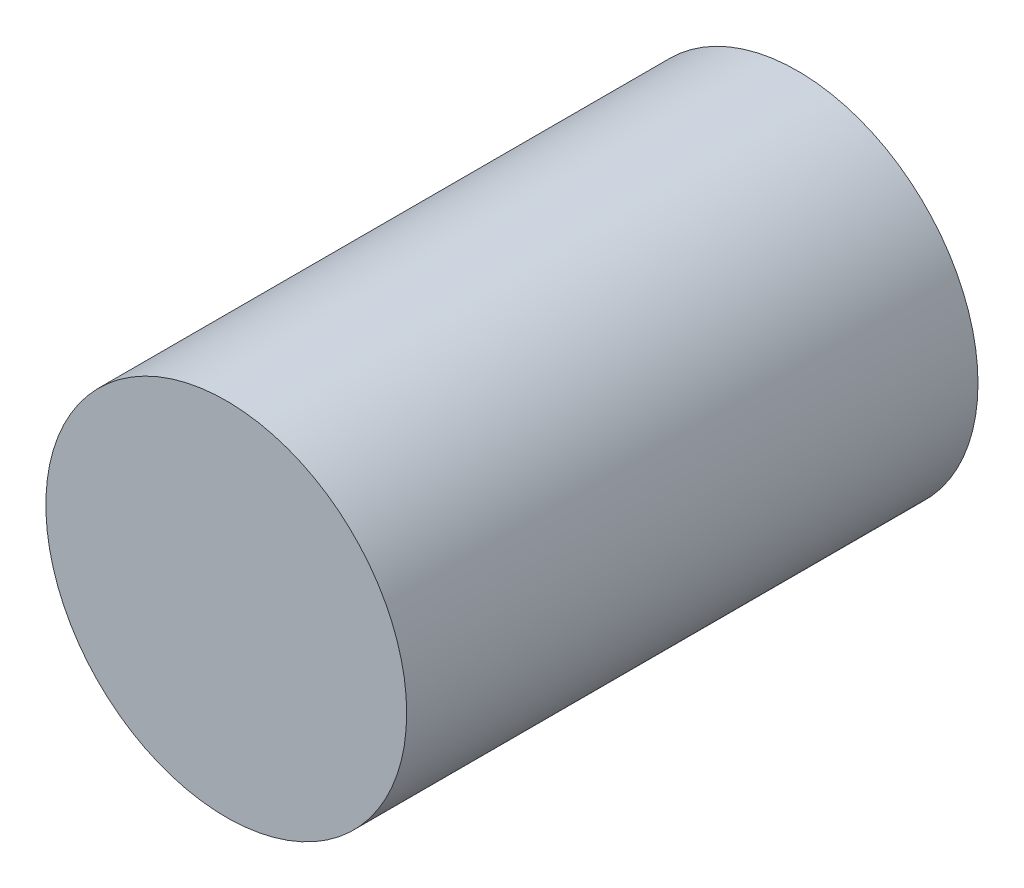
ISO-10303-21;
HEADER;
FILE_DESCRIPTION(('STEP AP214'),'2;1');
FILE_NAME('part.step','',(''),(''),'','','');
FILE_SCHEMA(('AUTOMOTIVE_DESIGN { 1 0 10303 214 1 1 1 1 }'));
ENDSEC;
DATA;
#1=APPLICATION_CONTEXT('core data for automotive mechanical design processes');
#2=APPLICATION_PROTOCOL_DEFINITION('international standard','automotive_design',2000,#1);
#3=PRODUCT_CONTEXT('',#1,'mechanical');
#4=PRODUCT('Part','Part','',(#3));
#5=PRODUCT_RELATED_PRODUCT_CATEGORY('part','',(#4));
#6=PRODUCT_DEFINITION_FORMATION('','',#4);
#7=PRODUCT_DEFINITION_CONTEXT('part definition',#1,'design');
#8=PRODUCT_DEFINITION('design','',#6,#7);
#9=PRODUCT_DEFINITION_SHAPE('','',#8);
#10=(LENGTH_UNIT() NAMED_UNIT(*) SI_UNIT(.MILLI.,.METRE.));
#11=(NAMED_UNIT(*) PLANE_ANGLE_UNIT() SI_UNIT($,.RADIAN.));
#12=(NAMED_UNIT(*) SI_UNIT($,.STERADIAN.) SOLID_ANGLE_UNIT());
#13=UNCERTAINTY_MEASURE_WITH_UNIT(LENGTH_MEASURE(1.E-05),#10,'distance_accuracy_value','');
#14=(GEOMETRIC_REPRESENTATION_CONTEXT(3) GLOBAL_UNCERTAINTY_ASSIGNED_CONTEXT((#13)) GLOBAL_UNIT_ASSIGNED_CONTEXT((#10,
#11,#12)) REPRESENTATION_CONTEXT('',''));
#15=CARTESIAN_POINT('',(0.,0.,0.));
#16=DIRECTION('',(0.,0.,1.));
#17=DIRECTION('',(1.,0.,0.));
#18=AXIS2_PLACEMENT_3D('',#15,#16,#17);
#19=CARTESIAN_POINT('',(0.,0.,9.5));
#20=DIRECTION('',(0.,0.,-1.));
#21=DIRECTION('',(-1.,0.,0.));
#22=AXIS2_PLACEMENT_3D('',#19,#20,#21);
#23=CYLINDRICAL_SURFACE('',#22,3.);
#24=CARTESIAN_POINT('',(0.,0.,9.5));
#25=DIRECTION('',(0.,0.,1.));
#26=DIRECTION('',(1.,0.,0.));
#27=AXIS2_PLACEMENT_3D('',#24,#25,#26);
#28=CIRCLE('',#27,3.);
#29=CARTESIAN_POINT('',(3.,0.,9.5));
#30=VERTEX_POINT('',#29);
#31=EDGE_CURVE('E10',#30,#30,#28,.T.);
#32=ORIENTED_EDGE('',*,*,#31,.F.);
#33=EDGE_LOOP('',(#32));
#34=FACE_BOUND('',#33,.T.);
#35=CARTESIAN_POINT('',(0.,0.,0.));
#36=DIRECTION('',(0.,0.,1.));
#37=DIRECTION('',(1.,0.,0.));
#38=AXIS2_PLACEMENT_3D('',#35,#36,#37);
#39=CIRCLE('',#38,3.);
#40=CARTESIAN_POINT('',(3.,0.,0.));
#41=VERTEX_POINT('',#40);
#42=EDGE_CURVE('E40',#41,#41,#39,.T.);
#43=ORIENTED_EDGE('',*,*,#42,.T.);
#44=EDGE_LOOP('',(#43));
#45=FACE_BOUND('',#44,.T.);
#46=ADVANCED_FACE('F37',(#34,#45),#23,.T.);
#47=CARTESIAN_POINT('',(0.,0.,9.5));
#48=DIRECTION('',(0.,0.,1.));
#49=DIRECTION('',(1.,0.,0.));
#50=AXIS2_PLACEMENT_3D('',#47,#48,#49);
#51=PLANE('',#50);
#52=ORIENTED_EDGE('',*,*,#31,.T.);
#53=EDGE_LOOP('',(#52));
#54=FACE_BOUND('',#53,.T.);
#55=ADVANCED_FACE('F52',(#54),#51,.T.);
#56=CARTESIAN_POINT('',(0.,0.,0.));
#57=DIRECTION('',(0.,0.,1.));
#58=DIRECTION('',(1.,0.,0.));
#59=AXIS2_PLACEMENT_3D('',#56,#57,#58);
#60=PLANE('',#59);
#61=ORIENTED_EDGE('',*,*,#42,.F.);
#62=EDGE_LOOP('',(#61));
#63=FACE_BOUND('',#62,.T.);
#64=ADVANCED_FACE('F50',(#63),#60,.F.);
#65=CLOSED_SHELL('',(#46,#55,#64));
#66=MANIFOLD_SOLID_BREP('B2',#65);
#67=ADVANCED_BREP_SHAPE_REPRESENTATION('',(#18,#66),#14);
#68=SHAPE_DEFINITION_REPRESENTATION(#9,#67);
ENDSEC;
END-ISO-10303-21;
